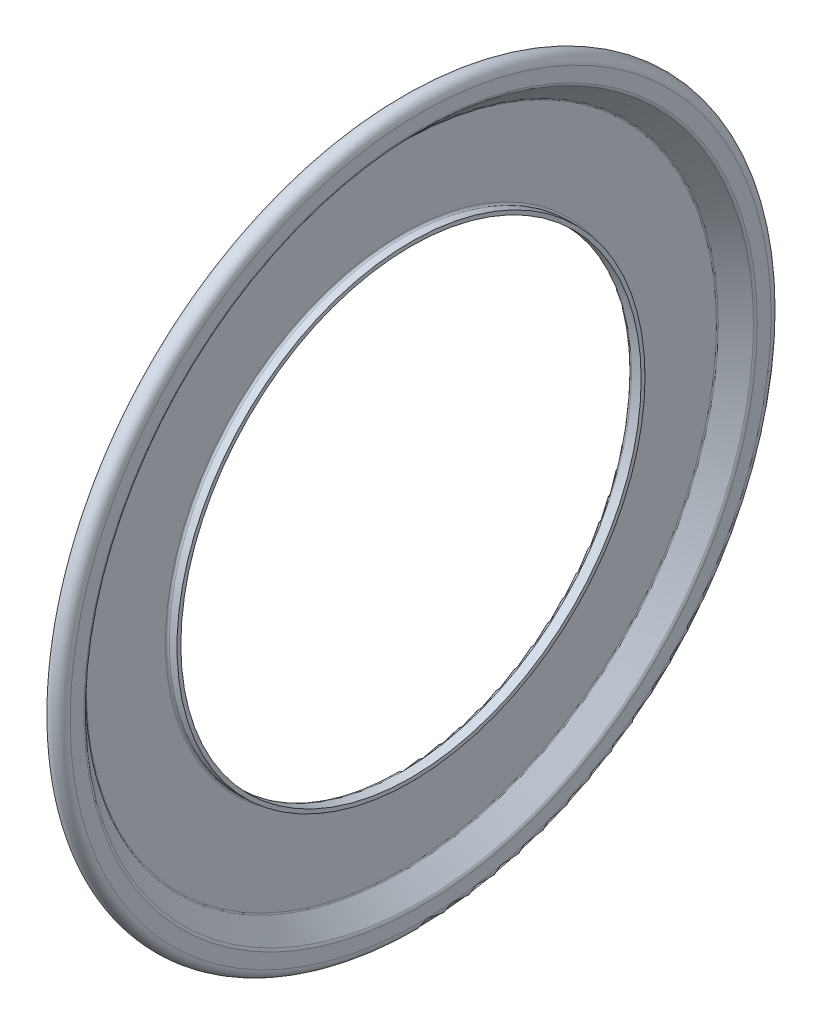
ISO-10303-21;
HEADER;
FILE_DESCRIPTION(('STEP AP214'),'2;1');
FILE_NAME('part.step','',(''),(''),'','','');
FILE_SCHEMA(('AUTOMOTIVE_DESIGN { 1 0 10303 214 1 1 1 1 }'));
ENDSEC;
DATA;
#1=APPLICATION_CONTEXT('core data for automotive mechanical design processes');
#2=APPLICATION_PROTOCOL_DEFINITION('international standard','automotive_design',2000,#1);
#3=PRODUCT_CONTEXT('',#1,'mechanical');
#4=PRODUCT('Part','Part','',(#3));
#5=PRODUCT_RELATED_PRODUCT_CATEGORY('part','',(#4));
#6=PRODUCT_DEFINITION_FORMATION('','',#4);
#7=PRODUCT_DEFINITION_CONTEXT('part definition',#1,'design');
#8=PRODUCT_DEFINITION('design','',#6,#7);
#9=PRODUCT_DEFINITION_SHAPE('','',#8);
#10=(LENGTH_UNIT() NAMED_UNIT(*) SI_UNIT(.MILLI.,.METRE.));
#11=(NAMED_UNIT(*) PLANE_ANGLE_UNIT() SI_UNIT($,.RADIAN.));
#12=(NAMED_UNIT(*) SI_UNIT($,.STERADIAN.) SOLID_ANGLE_UNIT());
#13=UNCERTAINTY_MEASURE_WITH_UNIT(LENGTH_MEASURE(1.E-05),#10,'distance_accuracy_value','');
#14=(GEOMETRIC_REPRESENTATION_CONTEXT(3) GLOBAL_UNCERTAINTY_ASSIGNED_CONTEXT((#13)) GLOBAL_UNIT_ASSIGNED_CONTEXT((#10,
#11,#12)) REPRESENTATION_CONTEXT('',''));
#15=CARTESIAN_POINT('',(0.,0.,0.));
#16=DIRECTION('',(0.,0.,1.));
#17=DIRECTION('',(1.,0.,0.));
#18=AXIS2_PLACEMENT_3D('',#15,#16,#17);
#19=CARTESIAN_POINT('',(0.36,9.8496,0.));
#20=DIRECTION('',(-1.,0.,0.));
#21=DIRECTION('',(0.,0.,1.));
#22=AXIS2_PLACEMENT_3D('',#19,#20,#21);
#23=PLANE('',#22);
#24=CARTESIAN_POINT('',(0.36,0.,0.));
#25=DIRECTION('',(1.,0.,0.));
#26=DIRECTION('',(0.,0.,-1.));
#27=AXIS2_PLACEMENT_3D('',#24,#25,#26);
#28=CIRCLE('',#27,7.2975);
#29=CARTESIAN_POINT('',(0.36,0.,-7.2975));
#30=VERTEX_POINT('',#29);
#31=EDGE_CURVE('E78',#30,#30,#28,.T.);
#32=ORIENTED_EDGE('',*,*,#31,.T.);
#33=EDGE_LOOP('',(#32));
#34=FACE_BOUND('',#33,.T.);
#35=CARTESIAN_POINT('',(0.36,0.,0.));
#36=DIRECTION('',(1.,0.,0.));
#37=DIRECTION('',(0.,0.,-1.));
#38=AXIS2_PLACEMENT_3D('',#35,#36,#37);
#39=CIRCLE('',#38,9.8496);
#40=CARTESIAN_POINT('',(0.36,0.,-9.8496));
#41=VERTEX_POINT('',#40);
#42=EDGE_CURVE('E76',#41,#41,#39,.T.);
#43=ORIENTED_EDGE('',*,*,#42,.F.);
#44=EDGE_LOOP('',(#43));
#45=FACE_BOUND('',#44,.T.);
#46=ADVANCED_FACE('F14',(#34,#45),#23,.T.);
#47=CARTESIAN_POINT('',(0.479999999999968,0.,0.));
#48=DIRECTION('',(1.,0.,0.));
#49=DIRECTION('',(0.,0.,-1.));
#50=AXIS2_PLACEMENT_3D('',#47,#48,#49);
#51=TOROIDAL_SURFACE('',#50,7.2975,0.119999999999968);
#52=CARTESIAN_POINT('',(0.48,0.,0.));
#53=DIRECTION('',(1.,0.,0.));
#54=DIRECTION('',(0.,0.,-1.));
#55=AXIS2_PLACEMENT_3D('',#52,#53,#54);
#56=CIRCLE('',#55,7.1775);
#57=CARTESIAN_POINT('',(0.48,0.,-7.1775));
#58=VERTEX_POINT('',#57);
#59=EDGE_CURVE('E73',#58,#58,#56,.T.);
#60=ORIENTED_EDGE('',*,*,#59,.T.);
#61=EDGE_LOOP('',(#60));
#62=FACE_BOUND('',#61,.T.);
#63=ORIENTED_EDGE('',*,*,#31,.F.);
#64=EDGE_LOOP('',(#63));
#65=FACE_BOUND('',#64,.T.);
#66=ADVANCED_FACE('F83',(#62,#65),#51,.T.);
#67=CARTESIAN_POINT('',(6.,0.,0.));
#68=DIRECTION('',(1.,0.,0.));
#69=DIRECTION('',(0.,0.,-1.));
#70=AXIS2_PLACEMENT_3D('',#67,#68,#69);
#71=CYLINDRICAL_SURFACE('',#70,7.1775);
#72=CARTESIAN_POINT('',(0.78,0.,0.));
#73=DIRECTION('',(1.,0.,0.));
#74=DIRECTION('',(0.,0.,-1.));
#75=AXIS2_PLACEMENT_3D('',#72,#73,#74);
#76=CIRCLE('',#75,7.1775);
#77=CARTESIAN_POINT('',(0.78,0.,-7.1775));
#78=VERTEX_POINT('',#77);
#79=EDGE_CURVE('E66',#78,#78,#76,.T.);
#80=ORIENTED_EDGE('',*,*,#79,.T.);
#81=EDGE_LOOP('',(#80));
#82=FACE_BOUND('',#81,.T.);
#83=ORIENTED_EDGE('',*,*,#59,.F.);
#84=EDGE_LOOP('',(#83));
#85=FACE_BOUND('',#84,.T.);
#86=ADVANCED_FACE('F87',(#82,#85),#71,.F.);
#87=CARTESIAN_POINT('',(0.78,7.1775,0.));
#88=DIRECTION('',(1.,0.,0.));
#89=DIRECTION('',(0.,0.,-1.));
#90=AXIS2_PLACEMENT_3D('',#87,#88,#89);
#91=PLANE('',#90);
#92=CARTESIAN_POINT('',(0.78,0.,0.));
#93=DIRECTION('',(1.,0.,0.));
#94=DIRECTION('',(0.,0.,-1.));
#95=AXIS2_PLACEMENT_3D('',#92,#93,#94);
#96=CIRCLE('',#95,7.2975);
#97=CARTESIAN_POINT('',(0.78,0.,-7.2975));
#98=VERTEX_POINT('',#97);
#99=EDGE_CURVE('E69',#98,#98,#96,.T.);
#100=ORIENTED_EDGE('',*,*,#99,.T.);
#101=EDGE_LOOP('',(#100));
#102=FACE_BOUND('',#101,.T.);
#103=ORIENTED_EDGE('',*,*,#79,.F.);
#104=EDGE_LOOP('',(#103));
#105=FACE_BOUND('',#104,.T.);
#106=ADVANCED_FACE('F92',(#102,#105),#91,.T.);
#107=CARTESIAN_POINT('',(6.,0.,0.));
#108=DIRECTION('',(1.,0.,0.));
#109=DIRECTION('',(0.,0.,-1.));
#110=AXIS2_PLACEMENT_3D('',#107,#108,#109);
#111=CYLINDRICAL_SURFACE('',#110,7.2975);
#112=CARTESIAN_POINT('',(0.54,0.,0.));
#113=DIRECTION('',(1.,0.,0.));
#114=DIRECTION('',(0.,0.,-1.));
#115=AXIS2_PLACEMENT_3D('',#112,#113,#114);
#116=CIRCLE('',#115,7.2975);
#117=CARTESIAN_POINT('',(0.54,0.,-7.2975));
#118=VERTEX_POINT('',#117);
#119=EDGE_CURVE('E63',#118,#118,#116,.T.);
#120=ORIENTED_EDGE('',*,*,#119,.T.);
#121=EDGE_LOOP('',(#120));
#122=FACE_BOUND('',#121,.T.);
#123=ORIENTED_EDGE('',*,*,#99,.F.);
#124=EDGE_LOOP('',(#123));
#125=FACE_BOUND('',#124,.T.);
#126=ADVANCED_FACE('F105',(#122,#125),#111,.T.);
#127=CARTESIAN_POINT('',(0.539999999999993,0.,0.));
#128=DIRECTION('',(1.,0.,0.));
#129=DIRECTION('',(0.,0.,-1.));
#130=AXIS2_PLACEMENT_3D('',#127,#128,#129);
#131=TOROIDAL_SURFACE('',#130,7.3575,0.0599999999999932);
#132=ORIENTED_EDGE('',*,*,#119,.F.);
#133=EDGE_LOOP('',(#132));
#134=FACE_BOUND('',#133,.T.);
#135=CARTESIAN_POINT('',(0.48,0.,0.));
#136=DIRECTION('',(1.,0.,0.));
#137=DIRECTION('',(0.,0.,-1.));
#138=AXIS2_PLACEMENT_3D('',#135,#136,#137);
#139=CIRCLE('',#138,7.35749999393612);
#140=CARTESIAN_POINT('',(0.48,0.,-7.35749999393612));
#141=VERTEX_POINT('',#140);
#142=EDGE_CURVE('E61',#141,#141,#139,.T.);
#143=ORIENTED_EDGE('',*,*,#142,.T.);
#144=EDGE_LOOP('',(#143));
#145=FACE_BOUND('',#144,.T.);
#146=ADVANCED_FACE('F106',(#134,#145),#131,.F.);
#147=CARTESIAN_POINT('',(0.48,7.3575,0.));
#148=DIRECTION('',(1.,0.,0.));
#149=DIRECTION('',(0.,0.,-1.));
#150=AXIS2_PLACEMENT_3D('',#147,#148,#149);
#151=PLANE('',#150);
#152=CARTESIAN_POINT('',(0.48,0.,0.));
#153=DIRECTION('',(1.,0.,0.));
#154=DIRECTION('',(0.,0.,-1.));
#155=AXIS2_PLACEMENT_3D('',#152,#153,#154);
#156=CIRCLE('',#155,9.8247471862576);
#157=CARTESIAN_POINT('',(0.48,0.,-9.8247471862576));
#158=VERTEX_POINT('',#157);
#159=EDGE_CURVE('E59',#158,#158,#156,.T.);
#160=ORIENTED_EDGE('',*,*,#159,.T.);
#161=EDGE_LOOP('',(#160));
#162=FACE_BOUND('',#161,.T.);
#163=ORIENTED_EDGE('',*,*,#142,.F.);
#164=EDGE_LOOP('',(#163));
#165=FACE_BOUND('',#164,.T.);
#166=ADVANCED_FACE('F109',(#162,#165),#151,.T.);
#167=CARTESIAN_POINT('',(0.540000000000017,0.,0.));
#168=DIRECTION('',(1.,0.,0.));
#169=DIRECTION('',(0.,0.,-1.));
#170=AXIS2_PLACEMENT_3D('',#167,#168,#169);
#171=TOROIDAL_SURFACE('',#170,9.8247471862576,0.0600000000000166);
#172=ORIENTED_EDGE('',*,*,#159,.F.);
#173=EDGE_LOOP('',(#172));
#174=FACE_BOUND('',#173,.T.);
#175=CARTESIAN_POINT('',(0.49757359312881,0.,0.));
#176=DIRECTION('',(1.,0.,0.));
#177=DIRECTION('',(0.,0.,-1.));
#178=AXIS2_PLACEMENT_3D('',#175,#176,#177);
#179=CIRCLE('',#178,9.8671735931288);
#180=CARTESIAN_POINT('',(0.49757359312881,0.,-9.8671735931288));
#181=VERTEX_POINT('',#180);
#182=EDGE_CURVE('E54',#181,#181,#179,.T.);
#183=ORIENTED_EDGE('',*,*,#182,.T.);
#184=EDGE_LOOP('',(#183));
#185=FACE_BOUND('',#184,.T.);
#186=ADVANCED_FACE('F111',(#174,#185),#171,.F.);
#187=CARTESIAN_POINT('',(0.49757359312881,0.,0.));
#188=DIRECTION('',(1.,0.,0.));
#189=DIRECTION('',(0.,0.,-1.));
#190=AXIS2_PLACEMENT_3D('',#187,#188,#189);
#191=CONICAL_SURFACE('',#190,9.8671735931288,0.785398163397091);
#192=CARTESIAN_POINT('',(1.0448528137424,0.,0.));
#193=DIRECTION('',(1.,0.,0.));
#194=DIRECTION('',(0.,0.,-1.));
#195=AXIS2_PLACEMENT_3D('',#192,#193,#194);
#196=CIRCLE('',#195,10.414452813742);
#197=CARTESIAN_POINT('',(1.0448528137424,0.,-10.414452813742));
#198=VERTEX_POINT('',#197);
#199=EDGE_CURVE('E55',#198,#198,#196,.T.);
#200=ORIENTED_EDGE('',*,*,#199,.T.);
#201=EDGE_LOOP('',(#200));
#202=FACE_BOUND('',#201,.T.);
#203=ORIENTED_EDGE('',*,*,#182,.F.);
#204=EDGE_LOOP('',(#203));
#205=FACE_BOUND('',#204,.T.);
#206=ADVANCED_FACE('F119',(#202,#205),#191,.F.);
#207=CARTESIAN_POINT('',(0.959999999998463,0.,0.));
#208=DIRECTION('',(1.,0.,0.));
#209=DIRECTION('',(0.,0.,-1.));
#210=AXIS2_PLACEMENT_3D('',#207,#208,#209);
#211=TOROIDAL_SURFACE('',#210,10.499305627485,0.120000000001538);
#212=CARTESIAN_POINT('',(1.08,0.,0.));
#213=DIRECTION('',(1.,0.,0.));
#214=DIRECTION('',(0.,0.,-1.));
#215=AXIS2_PLACEMENT_3D('',#212,#213,#214);
#216=CIRCLE('',#215,10.4993056166082);
#217=CARTESIAN_POINT('',(1.08,0.,-10.4993056166082));
#218=VERTEX_POINT('',#217);
#219=EDGE_CURVE('E47',#218,#218,#216,.T.);
#220=ORIENTED_EDGE('',*,*,#219,.T.);
#221=EDGE_LOOP('',(#220));
#222=FACE_BOUND('',#221,.T.);
#223=ORIENTED_EDGE('',*,*,#199,.F.);
#224=EDGE_LOOP('',(#223));
#225=FACE_BOUND('',#224,.T.);
#226=ADVANCED_FACE('F124',(#222,#225),#211,.T.);
#227=CARTESIAN_POINT('',(1.08,10.499305627485,0.));
#228=DIRECTION('',(1.,0.,0.));
#229=DIRECTION('',(0.,0.,-1.));
#230=AXIS2_PLACEMENT_3D('',#227,#228,#229);
#231=PLANE('',#230);
#232=CARTESIAN_POINT('',(1.08,0.,0.));
#233=DIRECTION('',(1.,0.,0.));
#234=DIRECTION('',(0.,0.,-1.));
#235=AXIS2_PLACEMENT_3D('',#232,#233,#234);
#236=CIRCLE('',#235,10.9296);
#237=CARTESIAN_POINT('',(1.08,0.,-10.9296));
#238=VERTEX_POINT('',#237);
#239=EDGE_CURVE('E46',#238,#238,#236,.T.);
#240=ORIENTED_EDGE('',*,*,#239,.T.);
#241=EDGE_LOOP('',(#240));
#242=FACE_BOUND('',#241,.T.);
#243=ORIENTED_EDGE('',*,*,#219,.F.);
#244=EDGE_LOOP('',(#243));
#245=FACE_BOUND('',#244,.T.);
#246=ADVANCED_FACE('F130',(#242,#245),#231,.T.);
#247=CARTESIAN_POINT('',(0.77999999999999,0.,0.));
#248=DIRECTION('',(1.,0.,0.));
#249=DIRECTION('',(0.,0.,-1.));
#250=AXIS2_PLACEMENT_3D('',#247,#248,#249);
#251=TOROIDAL_SURFACE('',#250,10.9296,0.30000000000001);
#252=CARTESIAN_POINT('',(0.78,0.,0.));
#253=DIRECTION('',(1.,0.,0.));
#254=DIRECTION('',(0.,0.,-1.));
#255=AXIS2_PLACEMENT_3D('',#252,#253,#254);
#256=CIRCLE('',#255,10.6296);
#257=CARTESIAN_POINT('',(0.78,0.,-10.6296));
#258=VERTEX_POINT('',#257);
#259=EDGE_CURVE('E43',#258,#258,#256,.T.);
#260=ORIENTED_EDGE('',*,*,#259,.T.);
#261=EDGE_LOOP('',(#260));
#262=FACE_BOUND('',#261,.T.);
#263=ORIENTED_EDGE('',*,*,#239,.F.);
#264=EDGE_LOOP('',(#263));
#265=FACE_BOUND('',#264,.T.);
#266=ADVANCED_FACE('F129',(#262,#265),#251,.T.);
#267=CARTESIAN_POINT('',(6.,0.,0.));
#268=DIRECTION('',(1.,0.,0.));
#269=DIRECTION('',(0.,0.,-1.));
#270=AXIS2_PLACEMENT_3D('',#267,#268,#269);
#271=CYLINDRICAL_SURFACE('',#270,10.6296);
#272=CARTESIAN_POINT('',(0.84,0.,0.));
#273=DIRECTION('',(1.,0.,0.));
#274=DIRECTION('',(0.,0.,-1.));
#275=AXIS2_PLACEMENT_3D('',#272,#273,#274);
#276=CIRCLE('',#275,10.6296);
#277=CARTESIAN_POINT('',(0.84,0.,-10.6296));
#278=VERTEX_POINT('',#277);
#279=EDGE_CURVE('E37',#278,#278,#276,.T.);
#280=ORIENTED_EDGE('',*,*,#279,.T.);
#281=EDGE_LOOP('',(#280));
#282=FACE_BOUND('',#281,.T.);
#283=ORIENTED_EDGE('',*,*,#259,.F.);
#284=EDGE_LOOP('',(#283));
#285=FACE_BOUND('',#284,.T.);
#286=ADVANCED_FACE('F133',(#282,#285),#271,.F.);
#287=CARTESIAN_POINT('',(0.84,10.6296,0.));
#288=DIRECTION('',(1.,0.,0.));
#289=DIRECTION('',(0.,0.,-1.));
#290=AXIS2_PLACEMENT_3D('',#287,#288,#289);
#291=PLANE('',#290);
#292=CARTESIAN_POINT('',(0.84,0.,0.));
#293=DIRECTION('',(1.,0.,0.));
#294=DIRECTION('',(0.,0.,-1.));
#295=AXIS2_PLACEMENT_3D('',#292,#293,#294);
#296=CIRCLE('',#295,10.7496);
#297=CARTESIAN_POINT('',(0.84,0.,-10.7496));
#298=VERTEX_POINT('',#297);
#299=EDGE_CURVE('E40',#298,#298,#296,.T.);
#300=ORIENTED_EDGE('',*,*,#299,.T.);
#301=EDGE_LOOP('',(#300));
#302=FACE_BOUND('',#301,.T.);
#303=ORIENTED_EDGE('',*,*,#279,.F.);
#304=EDGE_LOOP('',(#303));
#305=FACE_BOUND('',#304,.T.);
#306=ADVANCED_FACE('F139',(#302,#305),#291,.T.);
#307=CARTESIAN_POINT('',(6.,0.,0.));
#308=DIRECTION('',(1.,0.,0.));
#309=DIRECTION('',(0.,0.,-1.));
#310=AXIS2_PLACEMENT_3D('',#307,#308,#309);
#311=CYLINDRICAL_SURFACE('',#310,10.7496);
#312=CARTESIAN_POINT('',(0.78,0.,0.));
#313=DIRECTION('',(1.,0.,0.));
#314=DIRECTION('',(0.,0.,-1.));
#315=AXIS2_PLACEMENT_3D('',#312,#313,#314);
#316=CIRCLE('',#315,10.7496);
#317=CARTESIAN_POINT('',(0.78,0.,-10.7496));
#318=VERTEX_POINT('',#317);
#319=EDGE_CURVE('E35',#318,#318,#316,.T.);
#320=ORIENTED_EDGE('',*,*,#319,.T.);
#321=EDGE_LOOP('',(#320));
#322=FACE_BOUND('',#321,.T.);
#323=ORIENTED_EDGE('',*,*,#299,.F.);
#324=EDGE_LOOP('',(#323));
#325=FACE_BOUND('',#324,.T.);
#326=ADVANCED_FACE('F142',(#322,#325),#311,.T.);
#327=CARTESIAN_POINT('',(0.779999999999876,0.,0.));
#328=DIRECTION('',(1.,0.,0.));
#329=DIRECTION('',(0.,0.,-1.));
#330=AXIS2_PLACEMENT_3D('',#327,#328,#329);
#331=TOROIDAL_SURFACE('',#330,10.9296000000001,0.180000000000127);
#332=ORIENTED_EDGE('',*,*,#319,.F.);
#333=EDGE_LOOP('',(#332));
#334=FACE_BOUND('',#333,.T.);
#335=CARTESIAN_POINT('',(0.96,0.,0.));
#336=DIRECTION('',(1.,0.,0.));
#337=DIRECTION('',(0.,0.,-1.));
#338=AXIS2_PLACEMENT_3D('',#335,#336,#337);
#339=CIRCLE('',#338,10.9295999709876);
#340=CARTESIAN_POINT('',(0.96,0.,-10.9295999709876));
#341=VERTEX_POINT('',#340);
#342=EDGE_CURVE('E26',#341,#341,#339,.T.);
#343=ORIENTED_EDGE('',*,*,#342,.T.);
#344=EDGE_LOOP('',(#343));
#345=FACE_BOUND('',#344,.T.);
#346=ADVANCED_FACE('F148',(#334,#345),#331,.F.);
#347=CARTESIAN_POINT('',(0.96,10.9296,0.));
#348=DIRECTION('',(-1.,0.,0.));
#349=DIRECTION('',(0.,0.,1.));
#350=AXIS2_PLACEMENT_3D('',#347,#348,#349);
#351=PLANE('',#350);
#352=CARTESIAN_POINT('',(0.96,0.,0.));
#353=DIRECTION('',(1.,0.,0.));
#354=DIRECTION('',(0.,0.,-1.));
#355=AXIS2_PLACEMENT_3D('',#352,#353,#354);
#356=CIRCLE('',#355,10.524158449372);
#357=CARTESIAN_POINT('',(0.96,0.,-10.524158449372));
#358=VERTEX_POINT('',#357);
#359=EDGE_CURVE('E25',#358,#358,#356,.T.);
#360=ORIENTED_EDGE('',*,*,#359,.T.);
#361=EDGE_LOOP('',(#360));
#362=FACE_BOUND('',#361,.T.);
#363=ORIENTED_EDGE('',*,*,#342,.F.);
#364=EDGE_LOOP('',(#363));
#365=FACE_BOUND('',#364,.T.);
#366=ADVANCED_FACE('F147',(#362,#365),#351,.T.);
#367=CARTESIAN_POINT('',(0.900000000001378,0.,0.));
#368=DIRECTION('',(1.,0.,0.));
#369=DIRECTION('',(0.,0.,-1.));
#370=AXIS2_PLACEMENT_3D('',#367,#368,#369);
#371=TOROIDAL_SURFACE('',#370,10.5241584412266,0.0599999999986226);
#372=ORIENTED_EDGE('',*,*,#359,.F.);
#373=EDGE_LOOP('',(#372));
#374=FACE_BOUND('',#373,.T.);
#375=CARTESIAN_POINT('',(0.942426406871189,0.,0.));
#376=DIRECTION('',(1.,0.,0.));
#377=DIRECTION('',(0.,0.,-1.));
#378=AXIS2_PLACEMENT_3D('',#375,#376,#377);
#379=CIRCLE('',#378,10.481732034356);
#380=CARTESIAN_POINT('',(0.942426406871189,0.,-10.481732034356));
#381=VERTEX_POINT('',#380);
#382=EDGE_CURVE('E21',#381,#381,#379,.T.);
#383=ORIENTED_EDGE('',*,*,#382,.T.);
#384=EDGE_LOOP('',(#383));
#385=FACE_BOUND('',#384,.T.);
#386=ADVANCED_FACE('F152',(#374,#385),#371,.F.);
#387=CARTESIAN_POINT('',(0.942426406871189,0.,0.));
#388=DIRECTION('',(1.,0.,0.));
#389=DIRECTION('',(0.,0.,-1.));
#390=AXIS2_PLACEMENT_3D('',#387,#388,#389);
#391=CONICAL_SURFACE('',#390,10.481732034356,0.785398163397467);
#392=CARTESIAN_POINT('',(0.395147186257611,0.,0.));
#393=DIRECTION('',(1.,0.,0.));
#394=DIRECTION('',(0.,0.,-1.));
#395=AXIS2_PLACEMENT_3D('',#392,#393,#394);
#396=CIRCLE('',#395,9.9344528137424);
#397=CARTESIAN_POINT('',(0.395147186257611,0.,-9.9344528137424));
#398=VERTEX_POINT('',#397);
#399=EDGE_CURVE('E10',#398,#398,#396,.T.);
#400=ORIENTED_EDGE('',*,*,#399,.T.);
#401=EDGE_LOOP('',(#400));
#402=FACE_BOUND('',#401,.T.);
#403=ORIENTED_EDGE('',*,*,#382,.F.);
#404=EDGE_LOOP('',(#403));
#405=FACE_BOUND('',#404,.T.);
#406=ADVANCED_FACE('F160',(#402,#405),#391,.T.);
#407=CARTESIAN_POINT('',(0.480000000000182,0.,0.));
#408=DIRECTION('',(1.,0.,0.));
#409=DIRECTION('',(0.,0.,-1.));
#410=AXIS2_PLACEMENT_3D('',#407,#408,#409);
#411=TOROIDAL_SURFACE('',#410,9.8496,0.120000000000181);
#412=ORIENTED_EDGE('',*,*,#42,.T.);
#413=EDGE_LOOP('',(#412));
#414=FACE_BOUND('',#413,.T.);
#415=ORIENTED_EDGE('',*,*,#399,.F.);
#416=EDGE_LOOP('',(#415));
#417=FACE_BOUND('',#416,.T.);
#418=ADVANCED_FACE('F16',(#414,#417),#411,.T.);
#419=CLOSED_SHELL('',(#46,#66,#86,#106,#126,#146,#166,#186,#206,#226,#246,#266,#286,#306,#326,
#346,#366,#386,#406,#418));
#420=MANIFOLD_SOLID_BREP('B1',#419);
#421=ADVANCED_BREP_SHAPE_REPRESENTATION('',(#18,#420),#14);
#422=SHAPE_DEFINITION_REPRESENTATION(#9,#421);
ENDSEC;
END-ISO-10303-21;
